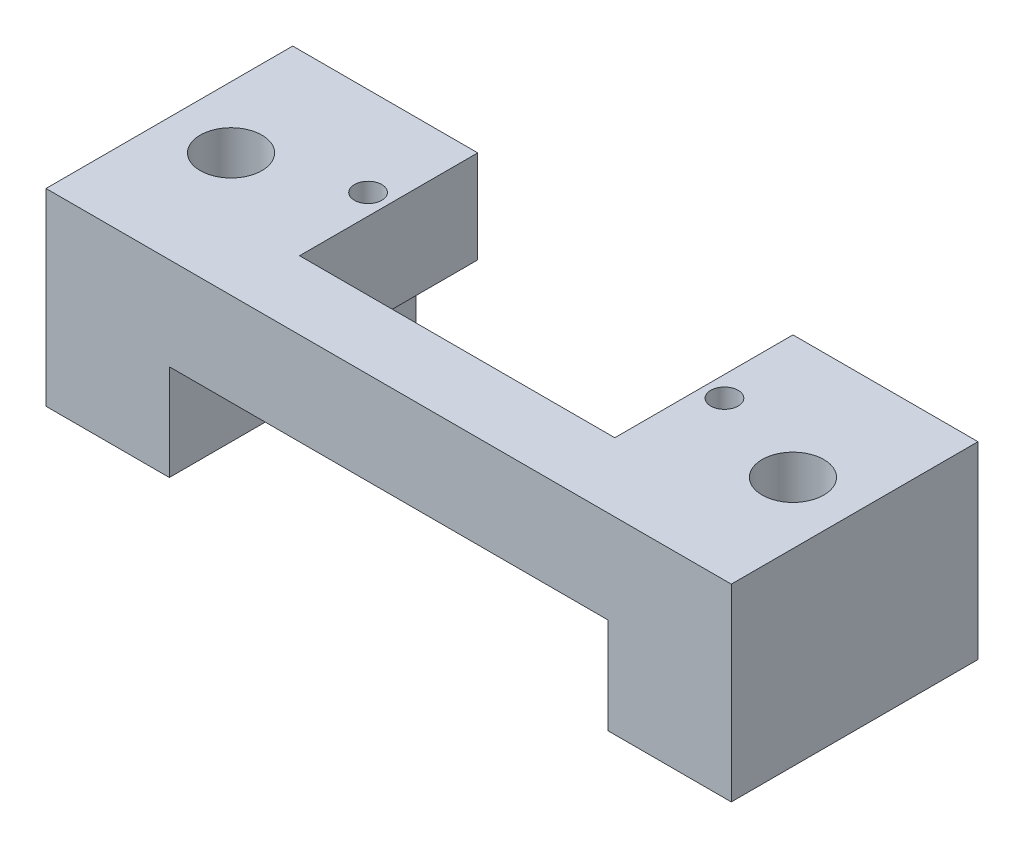
ISO-10303-21;
HEADER;
FILE_DESCRIPTION(('STEP AP214'),'2;1');
FILE_NAME('part.step','',(''),(''),'','','');
FILE_SCHEMA(('AUTOMOTIVE_DESIGN { 1 0 10303 214 1 1 1 1 }'));
ENDSEC;
DATA;
#1=APPLICATION_CONTEXT('core data for automotive mechanical design processes');
#2=APPLICATION_PROTOCOL_DEFINITION('international standard','automotive_design',2000,#1);
#3=PRODUCT_CONTEXT('',#1,'mechanical');
#4=PRODUCT('Part','Part','',(#3));
#5=PRODUCT_RELATED_PRODUCT_CATEGORY('part','',(#4));
#6=PRODUCT_DEFINITION_FORMATION('','',#4);
#7=PRODUCT_DEFINITION_CONTEXT('part definition',#1,'design');
#8=PRODUCT_DEFINITION('design','',#6,#7);
#9=PRODUCT_DEFINITION_SHAPE('','',#8);
#10=(LENGTH_UNIT() NAMED_UNIT(*) SI_UNIT(.MILLI.,.METRE.));
#11=(NAMED_UNIT(*) PLANE_ANGLE_UNIT() SI_UNIT($,.RADIAN.));
#12=(NAMED_UNIT(*) SI_UNIT($,.STERADIAN.) SOLID_ANGLE_UNIT());
#13=UNCERTAINTY_MEASURE_WITH_UNIT(LENGTH_MEASURE(1.E-05),#10,'distance_accuracy_value','');
#14=(GEOMETRIC_REPRESENTATION_CONTEXT(3) GLOBAL_UNCERTAINTY_ASSIGNED_CONTEXT((#13)) GLOBAL_UNIT_ASSIGNED_CONTEXT((#10,
#11,#12)) REPRESENTATION_CONTEXT('',''));
#15=CARTESIAN_POINT('',(0.,0.,0.));
#16=DIRECTION('',(0.,0.,1.));
#17=DIRECTION('',(1.,0.,0.));
#18=AXIS2_PLACEMENT_3D('',#15,#16,#17);
#19=CARTESIAN_POINT('',(0.,22.,-18.));
#20=DIRECTION('',(0.,0.,1.));
#21=DIRECTION('',(1.,0.,0.));
#22=AXIS2_PLACEMENT_3D('',#19,#20,#21);
#23=PLANE('',#22);
#24=DIRECTION('',(0.,-1.,0.));
#25=VECTOR('',#24,1.);
#26=CARTESIAN_POINT('',(0.,22.,-18.));
#27=LINE('',#26,#25);
#28=CARTESIAN_POINT('',(0.,13.764982964144,-18.));
#29=VERTEX_POINT('',#28);
#30=CARTESIAN_POINT('',(0.,0.,-18.));
#31=VERTEX_POINT('',#30);
#32=EDGE_CURVE('E152',#29,#31,#27,.T.);
#33=ORIENTED_EDGE('',*,*,#32,.F.);
#34=DIRECTION('',(-1.,0.,0.));
#35=VECTOR('',#34,1.);
#36=CARTESIAN_POINT('',(50.,13.764982964144,-18.));
#37=LINE('',#36,#35);
#38=CARTESIAN_POINT('',(13.5,13.764982964144,-18.));
#39=VERTEX_POINT('',#38);
#40=EDGE_CURVE('E183',#39,#29,#37,.T.);
#41=ORIENTED_EDGE('',*,*,#40,.F.);
#42=DIRECTION('',(0.,1.,0.));
#43=VECTOR('',#42,1.);
#44=CARTESIAN_POINT('',(13.5,-2.,-18.));
#45=LINE('',#44,#43);
#46=CARTESIAN_POINT('',(13.5,7.,-18.));
#47=VERTEX_POINT('',#46);
#48=EDGE_CURVE('E176',#47,#39,#45,.T.);
#49=ORIENTED_EDGE('',*,*,#48,.F.);
#50=DIRECTION('',(-1.,0.,0.));
#51=VECTOR('',#50,1.);
#52=CARTESIAN_POINT('',(9.,7.,-18.));
#53=LINE('',#52,#51);
#54=CARTESIAN_POINT('',(9.,7.,-18.));
#55=VERTEX_POINT('',#54);
#56=EDGE_CURVE('E169',#47,#55,#53,.T.);
#57=ORIENTED_EDGE('',*,*,#56,.T.);
#58=DIRECTION('',(0.,-1.,0.));
#59=VECTOR('',#58,1.);
#60=CARTESIAN_POINT('',(9.,-7.,-18.));
#61=LINE('',#60,#59);
#62=CARTESIAN_POINT('',(9.,0.,-18.));
#63=VERTEX_POINT('',#62);
#64=EDGE_CURVE('E199',#55,#63,#61,.T.);
#65=ORIENTED_EDGE('',*,*,#64,.T.);
#66=DIRECTION('',(-1.,0.,0.));
#67=VECTOR('',#66,1.);
#68=CARTESIAN_POINT('',(0.,0.,-18.));
#69=LINE('',#68,#67);
#70=EDGE_CURVE('E220',#63,#31,#69,.T.);
#71=ORIENTED_EDGE('',*,*,#70,.T.);
#72=EDGE_LOOP('',(#33,#41,#49,#57,#65,#71));
#73=FACE_BOUND('',#72,.T.);
#74=ADVANCED_FACE('F37',(#73),#23,.F.);
#75=CARTESIAN_POINT('',(0.,0.,0.));
#76=DIRECTION('',(0.,-1.,0.));
#77=DIRECTION('',(0.,0.,-1.));
#78=AXIS2_PLACEMENT_3D('',#75,#76,#77);
#79=PLANE('',#78);
#80=CARTESIAN_POINT('',(45.5,0.,-9.));
#81=DIRECTION('',(0.,1.,0.));
#82=DIRECTION('',(0.,0.,-1.));
#83=AXIS2_PLACEMENT_3D('',#80,#81,#82);
#84=CIRCLE('',#83,2.25);
#85=CARTESIAN_POINT('',(45.5,0.,-11.25));
#86=VERTEX_POINT('',#85);
#87=EDGE_CURVE('E369',#86,#86,#84,.T.);
#88=ORIENTED_EDGE('',*,*,#87,.T.);
#89=EDGE_LOOP('',(#88));
#90=FACE_BOUND('',#89,.T.);
#91=DIRECTION('',(0.,0.,1.));
#92=VECTOR('',#91,1.);
#93=CARTESIAN_POINT('',(41.,0.,0.));
#94=LINE('',#93,#92);
#95=CARTESIAN_POINT('',(41.,0.,-18.));
#96=VERTEX_POINT('',#95);
#97=CARTESIAN_POINT('',(41.,0.,0.));
#98=VERTEX_POINT('',#97);
#99=EDGE_CURVE('E157',#96,#98,#94,.T.);
#100=ORIENTED_EDGE('',*,*,#99,.F.);
#101=CARTESIAN_POINT('',(50.,0.,-18.));
#102=VERTEX_POINT('',#101);
#103=EDGE_CURVE('E221',#102,#96,#69,.T.);
#104=ORIENTED_EDGE('',*,*,#103,.F.);
#105=DIRECTION('',(0.,0.,-1.));
#106=VECTOR('',#105,1.);
#107=CARTESIAN_POINT('',(50.,0.,0.));
#108=LINE('',#107,#106);
#109=CARTESIAN_POINT('',(50.,0.,0.));
#110=VERTEX_POINT('',#109);
#111=EDGE_CURVE('E218',#110,#102,#108,.T.);
#112=ORIENTED_EDGE('',*,*,#111,.F.);
#113=DIRECTION('',(1.,0.,0.));
#114=VECTOR('',#113,1.);
#115=CARTESIAN_POINT('',(0.,0.,0.));
#116=LINE('',#115,#114);
#117=EDGE_CURVE('E146',#98,#110,#116,.T.);
#118=ORIENTED_EDGE('',*,*,#117,.F.);
#119=EDGE_LOOP('',(#100,#104,#112,#118));
#120=FACE_BOUND('',#119,.T.);
#121=ADVANCED_FACE('F241',(#90,#120),#79,.T.);
#122=CARTESIAN_POINT('',(0.,22.,0.));
#123=DIRECTION('',(1.,0.,0.));
#124=DIRECTION('',(0.,0.,-1.));
#125=AXIS2_PLACEMENT_3D('',#122,#123,#124);
#126=PLANE('',#125);
#127=DIRECTION('',(0.,-1.,0.));
#128=VECTOR('',#127,1.);
#129=CARTESIAN_POINT('',(0.,22.,0.));
#130=LINE('',#129,#128);
#131=CARTESIAN_POINT('',(0.,13.764982964144,0.));
#132=VERTEX_POINT('',#131);
#133=CARTESIAN_POINT('',(0.,0.,0.));
#134=VERTEX_POINT('',#133);
#135=EDGE_CURVE('E148',#132,#134,#130,.T.);
#136=ORIENTED_EDGE('',*,*,#135,.F.);
#137=DIRECTION('',(0.,0.,-1.));
#138=VECTOR('',#137,1.);
#139=CARTESIAN_POINT('',(0.,13.764982964144,0.));
#140=LINE('',#139,#138);
#141=EDGE_CURVE('E129',#132,#29,#140,.T.);
#142=ORIENTED_EDGE('',*,*,#141,.T.);
#143=ORIENTED_EDGE('',*,*,#32,.T.);
#144=DIRECTION('',(0.,0.,1.));
#145=VECTOR('',#144,1.);
#146=CARTESIAN_POINT('',(0.,0.,0.));
#147=LINE('',#146,#145);
#148=EDGE_CURVE('E210',#31,#134,#147,.T.);
#149=ORIENTED_EDGE('',*,*,#148,.T.);
#150=EDGE_LOOP('',(#136,#142,#143,#149));
#151=FACE_BOUND('',#150,.T.);
#152=ADVANCED_FACE('F39',(#151),#126,.F.);
#153=CARTESIAN_POINT('',(0.,22.,0.));
#154=DIRECTION('',(0.,0.,-1.));
#155=DIRECTION('',(-1.,0.,0.));
#156=AXIS2_PLACEMENT_3D('',#153,#154,#155);
#157=PLANE('',#156);
#158=DIRECTION('',(0.,-1.,0.));
#159=VECTOR('',#158,1.);
#160=CARTESIAN_POINT('',(50.,22.,0.));
#161=LINE('',#160,#159);
#162=CARTESIAN_POINT('',(50.,13.764982964144,0.));
#163=VERTEX_POINT('',#162);
#164=EDGE_CURVE('E139',#163,#110,#161,.T.);
#165=ORIENTED_EDGE('',*,*,#164,.F.);
#166=DIRECTION('',(-1.,0.,0.));
#167=VECTOR('',#166,1.);
#168=CARTESIAN_POINT('',(50.,13.764982964144,0.));
#169=LINE('',#168,#167);
#170=EDGE_CURVE('E123',#163,#132,#169,.T.);
#171=ORIENTED_EDGE('',*,*,#170,.T.);
#172=ORIENTED_EDGE('',*,*,#135,.T.);
#173=CARTESIAN_POINT('',(9.,0.,0.));
#174=VERTEX_POINT('',#173);
#175=EDGE_CURVE('E215',#134,#174,#116,.T.);
#176=ORIENTED_EDGE('',*,*,#175,.T.);
#177=DIRECTION('',(0.,-1.,0.));
#178=VECTOR('',#177,1.);
#179=CARTESIAN_POINT('',(9.,-7.,0.));
#180=LINE('',#179,#178);
#181=CARTESIAN_POINT('',(9.,7.,0.));
#182=VERTEX_POINT('',#181);
#183=EDGE_CURVE('E195',#182,#174,#180,.T.);
#184=ORIENTED_EDGE('',*,*,#183,.F.);
#185=DIRECTION('',(-1.,0.,0.));
#186=VECTOR('',#185,1.);
#187=CARTESIAN_POINT('',(9.,7.,0.));
#188=LINE('',#187,#186);
#189=CARTESIAN_POINT('',(41.,7.,0.));
#190=VERTEX_POINT('',#189);
#191=EDGE_CURVE('E204',#190,#182,#188,.T.);
#192=ORIENTED_EDGE('',*,*,#191,.F.);
#193=DIRECTION('',(0.,1.,0.));
#194=VECTOR('',#193,1.);
#195=CARTESIAN_POINT('',(41.,-7.,0.));
#196=LINE('',#195,#194);
#197=EDGE_CURVE('E202',#98,#190,#196,.T.);
#198=ORIENTED_EDGE('',*,*,#197,.F.);
#199=ORIENTED_EDGE('',*,*,#117,.T.);
#200=EDGE_LOOP('',(#165,#171,#172,#176,#184,#192,#198,#199));
#201=FACE_BOUND('',#200,.T.);
#202=ADVANCED_FACE('F143',(#201),#157,.F.);
#203=CARTESIAN_POINT('',(50.,22.,0.));
#204=DIRECTION('',(-1.,0.,0.));
#205=DIRECTION('',(0.,0.,1.));
#206=AXIS2_PLACEMENT_3D('',#203,#204,#205);
#207=PLANE('',#206);
#208=DIRECTION('',(0.,-1.,0.));
#209=VECTOR('',#208,1.);
#210=CARTESIAN_POINT('',(50.,22.,-18.));
#211=LINE('',#210,#209);
#212=CARTESIAN_POINT('',(50.,13.764982964144,-18.));
#213=VERTEX_POINT('',#212);
#214=EDGE_CURVE('E141',#213,#102,#211,.T.);
#215=ORIENTED_EDGE('',*,*,#214,.F.);
#216=DIRECTION('',(0.,0.,-1.));
#217=VECTOR('',#216,1.);
#218=CARTESIAN_POINT('',(50.,13.764982964144,0.));
#219=LINE('',#218,#217);
#220=EDGE_CURVE('E126',#163,#213,#219,.T.);
#221=ORIENTED_EDGE('',*,*,#220,.F.);
#222=ORIENTED_EDGE('',*,*,#164,.T.);
#223=ORIENTED_EDGE('',*,*,#111,.T.);
#224=EDGE_LOOP('',(#215,#221,#222,#223));
#225=FACE_BOUND('',#224,.T.);
#226=ADVANCED_FACE('F137',(#225),#207,.F.);
#227=DIRECTION('',(0.,-1.,0.));
#228=VECTOR('',#227,1.);
#229=CARTESIAN_POINT('',(36.5,-2.,-18.));
#230=LINE('',#229,#228);
#231=CARTESIAN_POINT('',(36.5,13.764982964144,-18.));
#232=VERTEX_POINT('',#231);
#233=CARTESIAN_POINT('',(36.5,7.,-18.));
#234=VERTEX_POINT('',#233);
#235=EDGE_CURVE('E184',#232,#234,#230,.T.);
#236=ORIENTED_EDGE('',*,*,#235,.F.);
#237=EDGE_CURVE('E133',#213,#232,#37,.T.);
#238=ORIENTED_EDGE('',*,*,#237,.F.);
#239=ORIENTED_EDGE('',*,*,#214,.T.);
#240=ORIENTED_EDGE('',*,*,#103,.T.);
#241=DIRECTION('',(0.,1.,0.));
#242=VECTOR('',#241,1.);
#243=CARTESIAN_POINT('',(41.,-7.,-18.));
#244=LINE('',#243,#242);
#245=CARTESIAN_POINT('',(41.,7.,-18.));
#246=VERTEX_POINT('',#245);
#247=EDGE_CURVE('E192',#96,#246,#244,.T.);
#248=ORIENTED_EDGE('',*,*,#247,.T.);
#249=EDGE_CURVE('E196',#246,#234,#53,.T.);
#250=ORIENTED_EDGE('',*,*,#249,.T.);
#251=EDGE_LOOP('',(#236,#238,#239,#240,#248,#250));
#252=FACE_BOUND('',#251,.T.);
#253=ADVANCED_FACE('F245',(#252),#23,.F.);
#254=CARTESIAN_POINT('',(4.5,0.,-9.));
#255=DIRECTION('',(0.,1.,0.));
#256=DIRECTION('',(0.,0.,1.));
#257=AXIS2_PLACEMENT_3D('',#254,#255,#256);
#258=CIRCLE('',#257,2.25);
#259=CARTESIAN_POINT('',(4.5,0.,-6.75));
#260=VERTEX_POINT('',#259);
#261=EDGE_CURVE('E355',#260,#260,#258,.T.);
#262=ORIENTED_EDGE('',*,*,#261,.T.);
#263=EDGE_LOOP('',(#262));
#264=FACE_BOUND('',#263,.T.);
#265=DIRECTION('',(0.,0.,-1.));
#266=VECTOR('',#265,1.);
#267=CARTESIAN_POINT('',(9.,0.,0.));
#268=LINE('',#267,#266);
#269=EDGE_CURVE('E150',#174,#63,#268,.T.);
#270=ORIENTED_EDGE('',*,*,#269,.F.);
#271=ORIENTED_EDGE('',*,*,#175,.F.);
#272=ORIENTED_EDGE('',*,*,#148,.F.);
#273=ORIENTED_EDGE('',*,*,#70,.F.);
#274=EDGE_LOOP('',(#270,#271,#272,#273));
#275=FACE_BOUND('',#274,.T.);
#276=ADVANCED_FACE('F231',(#264,#275),#79,.T.);
#277=CARTESIAN_POINT('',(41.,-7.,-18.));
#278=DIRECTION('',(1.,0.,0.));
#279=DIRECTION('',(0.,0.,-1.));
#280=AXIS2_PLACEMENT_3D('',#277,#278,#279);
#281=PLANE('',#280);
#282=ORIENTED_EDGE('',*,*,#99,.T.);
#283=ORIENTED_EDGE('',*,*,#197,.T.);
#284=DIRECTION('',(0.,0.,1.));
#285=VECTOR('',#284,1.);
#286=CARTESIAN_POINT('',(41.,7.,-18.));
#287=LINE('',#286,#285);
#288=EDGE_CURVE('E201',#246,#190,#287,.T.);
#289=ORIENTED_EDGE('',*,*,#288,.F.);
#290=ORIENTED_EDGE('',*,*,#247,.F.);
#291=EDGE_LOOP('',(#282,#283,#289,#290));
#292=FACE_BOUND('',#291,.T.);
#293=ADVANCED_FACE('F238',(#292),#281,.F.);
#294=CARTESIAN_POINT('',(9.,-7.,-18.));
#295=DIRECTION('',(-1.,0.,0.));
#296=DIRECTION('',(0.,0.,1.));
#297=AXIS2_PLACEMENT_3D('',#294,#295,#296);
#298=PLANE('',#297);
#299=ORIENTED_EDGE('',*,*,#269,.T.);
#300=ORIENTED_EDGE('',*,*,#64,.F.);
#301=DIRECTION('',(0.,0.,1.));
#302=VECTOR('',#301,1.);
#303=CARTESIAN_POINT('',(9.,7.,-18.));
#304=LINE('',#303,#302);
#305=EDGE_CURVE('E208',#55,#182,#304,.T.);
#306=ORIENTED_EDGE('',*,*,#305,.T.);
#307=ORIENTED_EDGE('',*,*,#183,.T.);
#308=EDGE_LOOP('',(#299,#300,#306,#307));
#309=FACE_BOUND('',#308,.T.);
#310=ADVANCED_FACE('F235',(#309),#298,.F.);
#311=CARTESIAN_POINT('',(9.,7.,-18.));
#312=DIRECTION('',(0.,1.,0.));
#313=DIRECTION('',(0.,0.,1.));
#314=AXIS2_PLACEMENT_3D('',#311,#312,#313);
#315=PLANE('',#314);
#316=CARTESIAN_POINT('',(38.,7.,-11.5));
#317=DIRECTION('',(0.,-1.,0.));
#318=DIRECTION('',(0.,0.,1.));
#319=AXIS2_PLACEMENT_3D('',#316,#317,#318);
#320=CIRCLE('',#319,0.999999999999998);
#321=CARTESIAN_POINT('',(38.,7.,-10.5));
#322=VERTEX_POINT('',#321);
#323=EDGE_CURVE('E356',#322,#322,#320,.T.);
#324=ORIENTED_EDGE('',*,*,#323,.F.);
#325=EDGE_LOOP('',(#324));
#326=FACE_BOUND('',#325,.T.);
#327=CARTESIAN_POINT('',(12.,7.,-11.5));
#328=DIRECTION('',(0.,-1.,0.));
#329=DIRECTION('',(0.,0.,-1.));
#330=AXIS2_PLACEMENT_3D('',#327,#328,#329);
#331=CIRCLE('',#330,0.999999999999999);
#332=CARTESIAN_POINT('',(12.,7.,-12.5));
#333=VERTEX_POINT('',#332);
#334=EDGE_CURVE('E353',#333,#333,#331,.T.);
#335=ORIENTED_EDGE('',*,*,#334,.F.);
#336=EDGE_LOOP('',(#335));
#337=FACE_BOUND('',#336,.T.);
#338=ORIENTED_EDGE('',*,*,#56,.F.);
#339=DIRECTION('',(0.,0.,1.));
#340=VECTOR('',#339,1.);
#341=CARTESIAN_POINT('',(13.5,7.,-18.));
#342=LINE('',#341,#340);
#343=CARTESIAN_POINT('',(13.5,7.,-5.));
#344=VERTEX_POINT('',#343);
#345=EDGE_CURVE('E45',#47,#344,#342,.T.);
#346=ORIENTED_EDGE('',*,*,#345,.T.);
#347=DIRECTION('',(1.,0.,0.));
#348=VECTOR('',#347,1.);
#349=CARTESIAN_POINT('',(9.,7.,-5.));
#350=LINE('',#349,#348);
#351=CARTESIAN_POINT('',(36.5,7.,-5.));
#352=VERTEX_POINT('',#351);
#353=EDGE_CURVE('E159',#344,#352,#350,.T.);
#354=ORIENTED_EDGE('',*,*,#353,.T.);
#355=DIRECTION('',(0.,0.,-1.));
#356=VECTOR('',#355,1.);
#357=CARTESIAN_POINT('',(36.5,7.,-18.));
#358=LINE('',#357,#356);
#359=EDGE_CURVE('E162',#352,#234,#358,.T.);
#360=ORIENTED_EDGE('',*,*,#359,.T.);
#361=ORIENTED_EDGE('',*,*,#249,.F.);
#362=ORIENTED_EDGE('',*,*,#288,.T.);
#363=ORIENTED_EDGE('',*,*,#191,.T.);
#364=ORIENTED_EDGE('',*,*,#305,.F.);
#365=EDGE_LOOP('',(#338,#346,#354,#360,#361,#362,#363,#364));
#366=FACE_BOUND('',#365,.T.);
#367=ADVANCED_FACE('F167',(#326,#337,#366),#315,.F.);
#368=CARTESIAN_POINT('',(13.5,-2.,-5.));
#369=DIRECTION('',(-1.,0.,0.));
#370=DIRECTION('',(0.,0.,1.));
#371=AXIS2_PLACEMENT_3D('',#368,#369,#370);
#372=PLANE('',#371);
#373=ORIENTED_EDGE('',*,*,#48,.T.);
#374=DIRECTION('',(0.,0.,1.));
#375=VECTOR('',#374,1.);
#376=CARTESIAN_POINT('',(13.5,13.764982964144,-5.));
#377=LINE('',#376,#375);
#378=CARTESIAN_POINT('',(13.5,13.764982964144,-5.));
#379=VERTEX_POINT('',#378);
#380=EDGE_CURVE('E185',#39,#379,#377,.T.);
#381=ORIENTED_EDGE('',*,*,#380,.T.);
#382=DIRECTION('',(0.,1.,0.));
#383=VECTOR('',#382,1.);
#384=CARTESIAN_POINT('',(13.5,-2.,-5.));
#385=LINE('',#384,#383);
#386=EDGE_CURVE('E178',#344,#379,#385,.T.);
#387=ORIENTED_EDGE('',*,*,#386,.F.);
#388=ORIENTED_EDGE('',*,*,#345,.F.);
#389=EDGE_LOOP('',(#373,#381,#387,#388));
#390=FACE_BOUND('',#389,.T.);
#391=ADVANCED_FACE('F174',(#390),#372,.F.);
#392=CARTESIAN_POINT('',(36.5,-2.,-5.));
#393=DIRECTION('',(1.,0.,0.));
#394=DIRECTION('',(0.,0.,-1.));
#395=AXIS2_PLACEMENT_3D('',#392,#393,#394);
#396=PLANE('',#395);
#397=DIRECTION('',(0.,-1.,0.));
#398=VECTOR('',#397,1.);
#399=CARTESIAN_POINT('',(36.5,-2.,-5.));
#400=LINE('',#399,#398);
#401=CARTESIAN_POINT('',(36.5,13.764982964144,-5.));
#402=VERTEX_POINT('',#401);
#403=EDGE_CURVE('E58',#402,#352,#400,.T.);
#404=ORIENTED_EDGE('',*,*,#403,.F.);
#405=DIRECTION('',(0.,0.,-1.));
#406=VECTOR('',#405,1.);
#407=CARTESIAN_POINT('',(36.5,13.764982964144,-5.));
#408=LINE('',#407,#406);
#409=EDGE_CURVE('E52',#402,#232,#408,.T.);
#410=ORIENTED_EDGE('',*,*,#409,.T.);
#411=ORIENTED_EDGE('',*,*,#235,.T.);
#412=ORIENTED_EDGE('',*,*,#359,.F.);
#413=EDGE_LOOP('',(#404,#410,#411,#412));
#414=FACE_BOUND('',#413,.T.);
#415=ADVANCED_FACE('F253',(#414),#396,.F.);
#416=CARTESIAN_POINT('',(0.,0.,-5.));
#417=DIRECTION('',(0.,0.,1.));
#418=DIRECTION('',(1.,0.,0.));
#419=AXIS2_PLACEMENT_3D('',#416,#417,#418);
#420=PLANE('',#419);
#421=ORIENTED_EDGE('',*,*,#386,.T.);
#422=DIRECTION('',(1.,0.,0.));
#423=VECTOR('',#422,1.);
#424=CARTESIAN_POINT('',(0.,13.764982964144,-5.));
#425=LINE('',#424,#423);
#426=EDGE_CURVE('E11',#379,#402,#425,.T.);
#427=ORIENTED_EDGE('',*,*,#426,.T.);
#428=ORIENTED_EDGE('',*,*,#403,.T.);
#429=ORIENTED_EDGE('',*,*,#353,.F.);
#430=EDGE_LOOP('',(#421,#427,#428,#429));
#431=FACE_BOUND('',#430,.T.);
#432=ADVANCED_FACE('F251',(#431),#420,.F.);
#433=CARTESIAN_POINT('',(50.,13.764982964144,0.));
#434=DIRECTION('',(0.,-1.,0.));
#435=DIRECTION('',(0.,0.,-1.));
#436=AXIS2_PLACEMENT_3D('',#433,#434,#435);
#437=PLANE('',#436);
#438=CARTESIAN_POINT('',(4.5,13.764982964144,-9.));
#439=DIRECTION('',(0.,1.,0.));
#440=DIRECTION('',(0.,0.,1.));
#441=AXIS2_PLACEMENT_3D('',#438,#439,#440);
#442=CIRCLE('',#441,2.25);
#443=CARTESIAN_POINT('',(4.5,13.764982964144,-6.75));
#444=VERTEX_POINT('',#443);
#445=EDGE_CURVE('E359',#444,#444,#442,.T.);
#446=ORIENTED_EDGE('',*,*,#445,.F.);
#447=EDGE_LOOP('',(#446));
#448=FACE_BOUND('',#447,.T.);
#449=CARTESIAN_POINT('',(45.5,13.764982964144,-9.));
#450=DIRECTION('',(0.,1.,0.));
#451=DIRECTION('',(0.,0.,-1.));
#452=AXIS2_PLACEMENT_3D('',#449,#450,#451);
#453=CIRCLE('',#452,2.25);
#454=CARTESIAN_POINT('',(45.5,13.764982964144,-11.25));
#455=VERTEX_POINT('',#454);
#456=EDGE_CURVE('E366',#455,#455,#453,.T.);
#457=ORIENTED_EDGE('',*,*,#456,.F.);
#458=EDGE_LOOP('',(#457));
#459=FACE_BOUND('',#458,.T.);
#460=CARTESIAN_POINT('',(38.,13.764982964144,-11.5));
#461=DIRECTION('',(0.,-1.,0.));
#462=DIRECTION('',(0.,0.,1.));
#463=AXIS2_PLACEMENT_3D('',#460,#461,#462);
#464=CIRCLE('',#463,0.999999999999998);
#465=CARTESIAN_POINT('',(38.,13.764982964144,-10.5));
#466=VERTEX_POINT('',#465);
#467=EDGE_CURVE('E247',#466,#466,#464,.T.);
#468=ORIENTED_EDGE('',*,*,#467,.T.);
#469=EDGE_LOOP('',(#468));
#470=FACE_BOUND('',#469,.T.);
#471=CARTESIAN_POINT('',(12.,13.764982964144,-11.5));
#472=DIRECTION('',(0.,-1.,0.));
#473=DIRECTION('',(0.,0.,-1.));
#474=AXIS2_PLACEMENT_3D('',#471,#472,#473);
#475=CIRCLE('',#474,0.999999999999999);
#476=CARTESIAN_POINT('',(12.,13.764982964144,-12.5));
#477=VERTEX_POINT('',#476);
#478=EDGE_CURVE('E350',#477,#477,#475,.T.);
#479=ORIENTED_EDGE('',*,*,#478,.T.);
#480=EDGE_LOOP('',(#479));
#481=FACE_BOUND('',#480,.T.);
#482=ORIENTED_EDGE('',*,*,#40,.T.);
#483=ORIENTED_EDGE('',*,*,#141,.F.);
#484=ORIENTED_EDGE('',*,*,#170,.F.);
#485=ORIENTED_EDGE('',*,*,#220,.T.);
#486=ORIENTED_EDGE('',*,*,#237,.T.);
#487=ORIENTED_EDGE('',*,*,#409,.F.);
#488=ORIENTED_EDGE('',*,*,#426,.F.);
#489=ORIENTED_EDGE('',*,*,#380,.F.);
#490=EDGE_LOOP('',(#482,#483,#484,#485,#486,#487,#488,#489));
#491=FACE_BOUND('',#490,.T.);
#492=ADVANCED_FACE('F125',(#448,#459,#470,#481,#491),#437,.F.);
#493=CARTESIAN_POINT('',(12.,13.764982964144,-11.5));
#494=DIRECTION('',(0.,-1.,0.));
#495=DIRECTION('',(0.,0.,-1.));
#496=AXIS2_PLACEMENT_3D('',#493,#494,#495);
#497=CYLINDRICAL_SURFACE('',#496,0.999999999999999);
#498=ORIENTED_EDGE('',*,*,#478,.F.);
#499=EDGE_LOOP('',(#498));
#500=FACE_BOUND('',#499,.T.);
#501=ORIENTED_EDGE('',*,*,#334,.T.);
#502=EDGE_LOOP('',(#501));
#503=FACE_BOUND('',#502,.T.);
#504=ADVANCED_FACE('F312',(#500,#503),#497,.F.);
#505=CARTESIAN_POINT('',(38.,13.764982964144,-11.5));
#506=DIRECTION('',(0.,-1.,0.));
#507=DIRECTION('',(0.,0.,-1.));
#508=AXIS2_PLACEMENT_3D('',#505,#506,#507);
#509=CYLINDRICAL_SURFACE('',#508,0.999999999999998);
#510=ORIENTED_EDGE('',*,*,#467,.F.);
#511=EDGE_LOOP('',(#510));
#512=FACE_BOUND('',#511,.T.);
#513=ORIENTED_EDGE('',*,*,#323,.T.);
#514=EDGE_LOOP('',(#513));
#515=FACE_BOUND('',#514,.T.);
#516=ADVANCED_FACE('F296',(#512,#515),#509,.F.);
#517=CARTESIAN_POINT('',(45.5,0.,-9.));
#518=DIRECTION('',(0.,1.,0.));
#519=DIRECTION('',(0.,0.,1.));
#520=AXIS2_PLACEMENT_3D('',#517,#518,#519);
#521=CYLINDRICAL_SURFACE('',#520,2.25);
#522=ORIENTED_EDGE('',*,*,#87,.F.);
#523=EDGE_LOOP('',(#522));
#524=FACE_BOUND('',#523,.T.);
#525=ORIENTED_EDGE('',*,*,#456,.T.);
#526=EDGE_LOOP('',(#525));
#527=FACE_BOUND('',#526,.T.);
#528=ADVANCED_FACE('F321',(#524,#527),#521,.F.);
#529=CARTESIAN_POINT('',(4.5,0.,-9.));
#530=DIRECTION('',(0.,1.,0.));
#531=DIRECTION('',(0.,0.,1.));
#532=AXIS2_PLACEMENT_3D('',#529,#530,#531);
#533=CYLINDRICAL_SURFACE('',#532,2.25);
#534=ORIENTED_EDGE('',*,*,#261,.F.);
#535=EDGE_LOOP('',(#534));
#536=FACE_BOUND('',#535,.T.);
#537=ORIENTED_EDGE('',*,*,#445,.T.);
#538=EDGE_LOOP('',(#537));
#539=FACE_BOUND('',#538,.T.);
#540=ADVANCED_FACE('F326',(#536,#539),#533,.F.);
#541=CLOSED_SHELL('',(#74,#121,#152,#202,#226,#253,#276,#293,#310,#367,#391,#415,#432,#492,#504,
#516,#528,#540));
#542=MANIFOLD_SOLID_BREP('B2',#541);
#543=ADVANCED_BREP_SHAPE_REPRESENTATION('',(#18,#542),#14);
#544=SHAPE_DEFINITION_REPRESENTATION(#9,#543);
ENDSEC;
END-ISO-10303-21;
